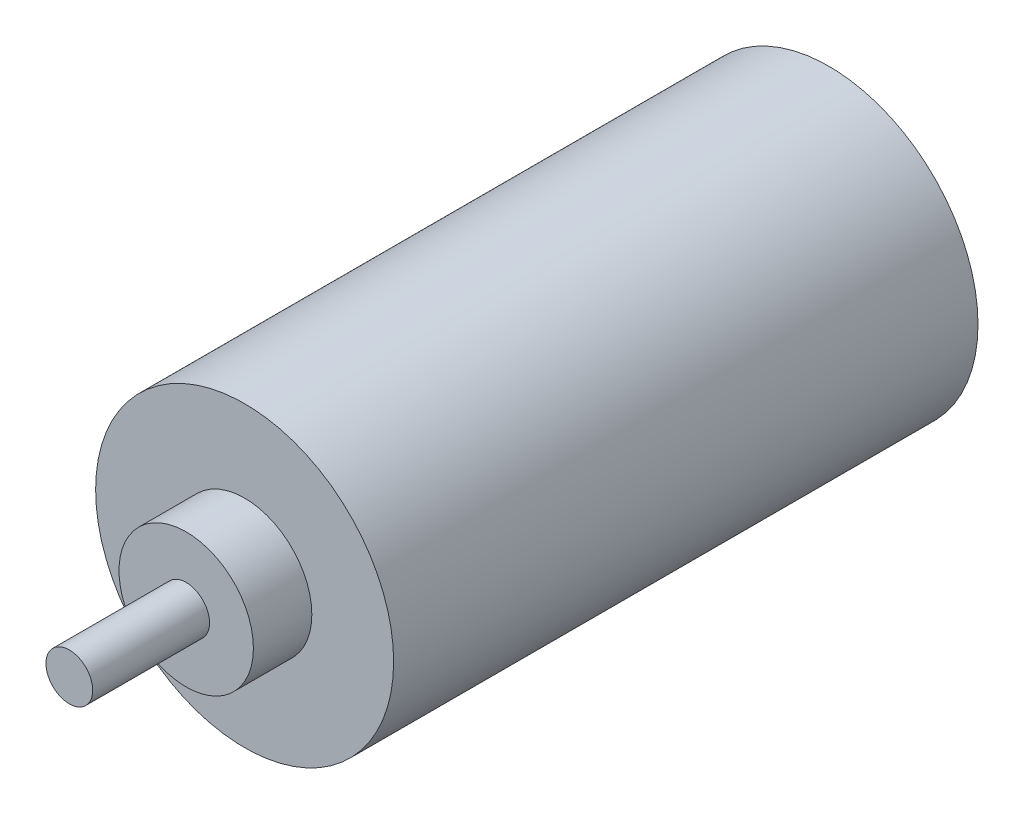
ISO-10303-21;
HEADER;
FILE_DESCRIPTION(('STEP AP214'),'2;1');
FILE_NAME('part.step','',(''),(''),'','','');
FILE_SCHEMA(('AUTOMOTIVE_DESIGN { 1 0 10303 214 1 1 1 1 }'));
ENDSEC;
DATA;
#1=APPLICATION_CONTEXT('core data for automotive mechanical design processes');
#2=APPLICATION_PROTOCOL_DEFINITION('international standard','automotive_design',2000,#1);
#3=PRODUCT_CONTEXT('',#1,'mechanical');
#4=PRODUCT('Part','Part','',(#3));
#5=PRODUCT_RELATED_PRODUCT_CATEGORY('part','',(#4));
#6=PRODUCT_DEFINITION_FORMATION('','',#4);
#7=PRODUCT_DEFINITION_CONTEXT('part definition',#1,'design');
#8=PRODUCT_DEFINITION('design','',#6,#7);
#9=PRODUCT_DEFINITION_SHAPE('','',#8);
#10=(LENGTH_UNIT() NAMED_UNIT(*) SI_UNIT(.MILLI.,.METRE.));
#11=(NAMED_UNIT(*) PLANE_ANGLE_UNIT() SI_UNIT($,.RADIAN.));
#12=(NAMED_UNIT(*) SI_UNIT($,.STERADIAN.) SOLID_ANGLE_UNIT());
#13=UNCERTAINTY_MEASURE_WITH_UNIT(LENGTH_MEASURE(1.E-05),#10,'distance_accuracy_value','');
#14=(GEOMETRIC_REPRESENTATION_CONTEXT(3) GLOBAL_UNCERTAINTY_ASSIGNED_CONTEXT((#13)) GLOBAL_UNIT_ASSIGNED_CONTEXT((#10,
#11,#12)) REPRESENTATION_CONTEXT('',''));
#15=CARTESIAN_POINT('',(0.,0.,0.));
#16=DIRECTION('',(0.,0.,1.));
#17=DIRECTION('',(1.,0.,0.));
#18=AXIS2_PLACEMENT_3D('',#15,#16,#17);
#19=CARTESIAN_POINT('',(0.,0.,13.));
#20=DIRECTION('',(0.,0.,1.));
#21=DIRECTION('',(1.,0.,0.));
#22=AXIS2_PLACEMENT_3D('',#19,#20,#21);
#23=PLANE('',#22);
#24=CARTESIAN_POINT('',(0.,0.,13.));
#25=DIRECTION('',(0.,0.,1.));
#26=DIRECTION('',(1.,0.,0.));
#27=AXIS2_PLACEMENT_3D('',#24,#25,#26);
#28=CIRCLE('',#27,0.4);
#29=CARTESIAN_POINT('',(0.4,0.,13.));
#30=VERTEX_POINT('',#29);
#31=EDGE_CURVE('E17',#30,#30,#28,.F.);
#32=ORIENTED_EDGE('',*,*,#31,.F.);
#33=EDGE_LOOP('',(#32));
#34=FACE_BOUND('',#33,.T.);
#35=ADVANCED_FACE('F14',(#34),#23,.T.);
#36=CARTESIAN_POINT('',(0.,0.,11.));
#37=DIRECTION('',(0.,0.,1.));
#38=DIRECTION('',(1.,0.,0.));
#39=AXIS2_PLACEMENT_3D('',#36,#37,#38);
#40=CYLINDRICAL_SURFACE('',#39,0.4);
#41=CARTESIAN_POINT('',(0.,0.,11.));
#42=DIRECTION('',(0.,0.,1.));
#43=DIRECTION('',(1.,0.,0.));
#44=AXIS2_PLACEMENT_3D('',#41,#42,#43);
#45=CIRCLE('',#44,0.4);
#46=CARTESIAN_POINT('',(0.4,0.,11.));
#47=VERTEX_POINT('',#46);
#48=EDGE_CURVE('E39',#47,#47,#45,.F.);
#49=ORIENTED_EDGE('',*,*,#48,.F.);
#50=EDGE_LOOP('',(#49));
#51=FACE_BOUND('',#50,.T.);
#52=ORIENTED_EDGE('',*,*,#31,.T.);
#53=EDGE_LOOP('',(#52));
#54=FACE_BOUND('',#53,.T.);
#55=ADVANCED_FACE('F47',(#51,#54),#40,.T.);
#56=CARTESIAN_POINT('',(0.,0.,11.));
#57=DIRECTION('',(0.,0.,1.));
#58=DIRECTION('',(1.,0.,0.));
#59=AXIS2_PLACEMENT_3D('',#56,#57,#58);
#60=PLANE('',#59);
#61=ORIENTED_EDGE('',*,*,#48,.T.);
#62=EDGE_LOOP('',(#61));
#63=FACE_BOUND('',#62,.T.);
#64=CARTESIAN_POINT('',(0.,0.,11.));
#65=DIRECTION('',(0.,0.,1.));
#66=DIRECTION('',(1.,0.,0.));
#67=AXIS2_PLACEMENT_3D('',#64,#65,#66);
#68=CIRCLE('',#67,1.15);
#69=CARTESIAN_POINT('',(1.15,0.,11.));
#70=VERTEX_POINT('',#69);
#71=EDGE_CURVE('E36',#70,#70,#68,.F.);
#72=ORIENTED_EDGE('',*,*,#71,.F.);
#73=EDGE_LOOP('',(#72));
#74=FACE_BOUND('',#73,.T.);
#75=ADVANCED_FACE('F54',(#63,#74),#60,.T.);
#76=CARTESIAN_POINT('',(0.,0.,10.));
#77=DIRECTION('',(0.,0.,1.));
#78=DIRECTION('',(1.,0.,0.));
#79=AXIS2_PLACEMENT_3D('',#76,#77,#78);
#80=CYLINDRICAL_SURFACE('',#79,1.15);
#81=CARTESIAN_POINT('',(0.,0.,10.));
#82=DIRECTION('',(0.,0.,1.));
#83=DIRECTION('',(1.,0.,0.));
#84=AXIS2_PLACEMENT_3D('',#81,#82,#83);
#85=CIRCLE('',#84,1.15);
#86=CARTESIAN_POINT('',(1.15,0.,10.));
#87=VERTEX_POINT('',#86);
#88=EDGE_CURVE('E30',#87,#87,#85,.F.);
#89=ORIENTED_EDGE('',*,*,#88,.F.);
#90=EDGE_LOOP('',(#89));
#91=FACE_BOUND('',#90,.T.);
#92=ORIENTED_EDGE('',*,*,#71,.T.);
#93=EDGE_LOOP('',(#92));
#94=FACE_BOUND('',#93,.T.);
#95=ADVANCED_FACE('F70',(#91,#94),#80,.T.);
#96=CARTESIAN_POINT('',(0.,0.,10.));
#97=DIRECTION('',(0.,0.,1.));
#98=DIRECTION('',(1.,0.,0.));
#99=AXIS2_PLACEMENT_3D('',#96,#97,#98);
#100=PLANE('',#99);
#101=ORIENTED_EDGE('',*,*,#88,.T.);
#102=EDGE_LOOP('',(#101));
#103=FACE_BOUND('',#102,.T.);
#104=CARTESIAN_POINT('',(0.,0.,10.));
#105=DIRECTION('',(0.,0.,1.));
#106=DIRECTION('',(1.,0.,0.));
#107=AXIS2_PLACEMENT_3D('',#104,#105,#106);
#108=CIRCLE('',#107,2.55);
#109=CARTESIAN_POINT('',(2.55,0.,10.));
#110=VERTEX_POINT('',#109);
#111=EDGE_CURVE('E22',#110,#110,#108,.F.);
#112=ORIENTED_EDGE('',*,*,#111,.F.);
#113=EDGE_LOOP('',(#112));
#114=FACE_BOUND('',#113,.T.);
#115=ADVANCED_FACE('F63',(#103,#114),#100,.T.);
#116=CARTESIAN_POINT('',(0.,0.,0.));
#117=DIRECTION('',(0.,0.,1.));
#118=DIRECTION('',(1.,0.,0.));
#119=AXIS2_PLACEMENT_3D('',#116,#117,#118);
#120=PLANE('',#119);
#121=CARTESIAN_POINT('',(0.,0.,0.));
#122=DIRECTION('',(0.,0.,1.));
#123=DIRECTION('',(1.,0.,0.));
#124=AXIS2_PLACEMENT_3D('',#121,#122,#123);
#125=CIRCLE('',#124,2.55);
#126=CARTESIAN_POINT('',(2.55,0.,0.));
#127=VERTEX_POINT('',#126);
#128=EDGE_CURVE('E10',#127,#127,#125,.T.);
#129=ORIENTED_EDGE('',*,*,#128,.F.);
#130=EDGE_LOOP('',(#129));
#131=FACE_BOUND('',#130,.T.);
#132=ADVANCED_FACE('F58',(#131),#120,.F.);
#133=CARTESIAN_POINT('',(0.,0.,0.));
#134=DIRECTION('',(0.,0.,1.));
#135=DIRECTION('',(1.,0.,0.));
#136=AXIS2_PLACEMENT_3D('',#133,#134,#135);
#137=CYLINDRICAL_SURFACE('',#136,2.55);
#138=ORIENTED_EDGE('',*,*,#128,.T.);
#139=EDGE_LOOP('',(#138));
#140=FACE_BOUND('',#139,.T.);
#141=ORIENTED_EDGE('',*,*,#111,.T.);
#142=EDGE_LOOP('',(#141));
#143=FACE_BOUND('',#142,.T.);
#144=ADVANCED_FACE('F56',(#140,#143),#137,.T.);
#145=CLOSED_SHELL('',(#35,#55,#75,#95,#115,#132,#144));
#146=MANIFOLD_SOLID_BREP('B1',#145);
#147=ADVANCED_BREP_SHAPE_REPRESENTATION('',(#18,#146),#14);
#148=SHAPE_DEFINITION_REPRESENTATION(#9,#147);
ENDSEC;
END-ISO-10303-21;
